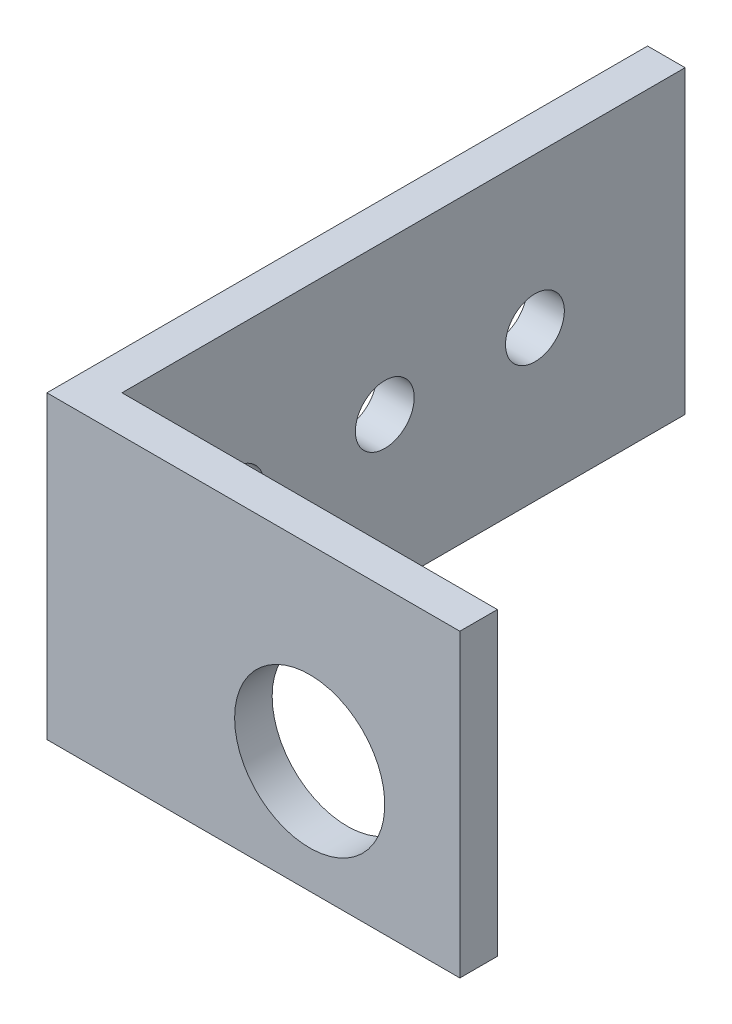
ISO-10303-21;
HEADER;
FILE_DESCRIPTION(('STEP AP214'),'2;1');
FILE_NAME('part.step','',(''),(''),'','','');
FILE_SCHEMA(('AUTOMOTIVE_DESIGN { 1 0 10303 214 1 1 1 1 }'));
ENDSEC;
DATA;
#1=APPLICATION_CONTEXT('core data for automotive mechanical design processes');
#2=APPLICATION_PROTOCOL_DEFINITION('international standard','automotive_design',2000,#1);
#3=PRODUCT_CONTEXT('',#1,'mechanical');
#4=PRODUCT('Part','Part','',(#3));
#5=PRODUCT_RELATED_PRODUCT_CATEGORY('part','',(#4));
#6=PRODUCT_DEFINITION_FORMATION('','',#4);
#7=PRODUCT_DEFINITION_CONTEXT('part definition',#1,'design');
#8=PRODUCT_DEFINITION('design','',#6,#7);
#9=PRODUCT_DEFINITION_SHAPE('','',#8);
#10=(LENGTH_UNIT() NAMED_UNIT(*) SI_UNIT(.MILLI.,.METRE.));
#11=(NAMED_UNIT(*) PLANE_ANGLE_UNIT() SI_UNIT($,.RADIAN.));
#12=(NAMED_UNIT(*) SI_UNIT($,.STERADIAN.) SOLID_ANGLE_UNIT());
#13=UNCERTAINTY_MEASURE_WITH_UNIT(LENGTH_MEASURE(1.E-05),#10,'distance_accuracy_value','');
#14=(GEOMETRIC_REPRESENTATION_CONTEXT(3) GLOBAL_UNCERTAINTY_ASSIGNED_CONTEXT((#13)) GLOBAL_UNIT_ASSIGNED_CONTEXT((#10,
#11,#12)) REPRESENTATION_CONTEXT('',''));
#15=CARTESIAN_POINT('',(0.,0.,0.));
#16=DIRECTION('',(0.,0.,1.));
#17=DIRECTION('',(1.,0.,0.));
#18=AXIS2_PLACEMENT_3D('',#15,#16,#17);
#19=CARTESIAN_POINT('',(34.925,25.4,0.));
#20=DIRECTION('',(0.,0.,-1.));
#21=DIRECTION('',(-1.,0.,0.));
#22=AXIS2_PLACEMENT_3D('',#19,#20,#21);
#23=PLANE('',#22);
#24=CARTESIAN_POINT('',(22.225,9.525,0.));
#25=DIRECTION('',(0.,0.,-1.));
#26=DIRECTION('',(-1.,0.,0.));
#27=AXIS2_PLACEMENT_3D('',#24,#25,#26);
#28=CIRCLE('',#27,6.35);
#29=CARTESIAN_POINT('',(15.875,9.525,0.));
#30=VERTEX_POINT('',#29);
#31=EDGE_CURVE('E135',#30,#30,#28,.T.);
#32=ORIENTED_EDGE('',*,*,#31,.T.);
#33=EDGE_LOOP('',(#32));
#34=FACE_BOUND('',#33,.T.);
#35=DIRECTION('',(1.,0.,0.));
#36=VECTOR('',#35,1.);
#37=CARTESIAN_POINT('',(34.925,0.,0.));
#38=LINE('',#37,#36);
#39=CARTESIAN_POINT('',(0.,0.,0.));
#40=VERTEX_POINT('',#39);
#41=CARTESIAN_POINT('',(34.925,0.,0.));
#42=VERTEX_POINT('',#41);
#43=EDGE_CURVE('E130',#40,#42,#38,.T.);
#44=ORIENTED_EDGE('',*,*,#43,.T.);
#45=DIRECTION('',(0.,-1.,0.));
#46=VECTOR('',#45,1.);
#47=CARTESIAN_POINT('',(34.925,25.4,0.));
#48=LINE('',#47,#46);
#49=CARTESIAN_POINT('',(34.925,25.4,0.));
#50=VERTEX_POINT('',#49);
#51=EDGE_CURVE('E11',#50,#42,#48,.T.);
#52=ORIENTED_EDGE('',*,*,#51,.F.);
#53=DIRECTION('',(1.,0.,0.));
#54=VECTOR('',#53,1.);
#55=CARTESIAN_POINT('',(34.925,25.4,0.));
#56=LINE('',#55,#54);
#57=CARTESIAN_POINT('',(0.,25.4,0.));
#58=VERTEX_POINT('',#57);
#59=EDGE_CURVE('E147',#58,#50,#56,.T.);
#60=ORIENTED_EDGE('',*,*,#59,.F.);
#61=DIRECTION('',(0.,-1.,0.));
#62=VECTOR('',#61,1.);
#63=CARTESIAN_POINT('',(0.,25.4,0.));
#64=LINE('',#63,#62);
#65=EDGE_CURVE('E126',#58,#40,#64,.T.);
#66=ORIENTED_EDGE('',*,*,#65,.T.);
#67=EDGE_LOOP('',(#44,#52,#60,#66));
#68=FACE_BOUND('',#67,.T.);
#69=ADVANCED_FACE('F40',(#34,#68),#23,.F.);
#70=CARTESIAN_POINT('',(34.925,25.4,-3.175));
#71=DIRECTION('',(-1.,0.,0.));
#72=DIRECTION('',(0.,0.,1.));
#73=AXIS2_PLACEMENT_3D('',#70,#71,#72);
#74=PLANE('',#73);
#75=DIRECTION('',(0.,0.,-1.));
#76=VECTOR('',#75,1.);
#77=CARTESIAN_POINT('',(34.925,0.,-3.175));
#78=LINE('',#77,#76);
#79=CARTESIAN_POINT('',(34.925,0.,-3.175));
#80=VERTEX_POINT('',#79);
#81=EDGE_CURVE('E134',#42,#80,#78,.T.);
#82=ORIENTED_EDGE('',*,*,#81,.T.);
#83=DIRECTION('',(0.,-1.,0.));
#84=VECTOR('',#83,1.);
#85=CARTESIAN_POINT('',(34.925,25.4,-3.175));
#86=LINE('',#85,#84);
#87=CARTESIAN_POINT('',(34.925,25.4,-3.175));
#88=VERTEX_POINT('',#87);
#89=EDGE_CURVE('E49',#88,#80,#86,.T.);
#90=ORIENTED_EDGE('',*,*,#89,.F.);
#91=DIRECTION('',(0.,0.,-1.));
#92=VECTOR('',#91,1.);
#93=CARTESIAN_POINT('',(34.925,25.4,-3.175));
#94=LINE('',#93,#92);
#95=EDGE_CURVE('E94',#50,#88,#94,.T.);
#96=ORIENTED_EDGE('',*,*,#95,.F.);
#97=ORIENTED_EDGE('',*,*,#51,.T.);
#98=EDGE_LOOP('',(#82,#90,#96,#97));
#99=FACE_BOUND('',#98,.T.);
#100=ADVANCED_FACE('F179',(#99),#74,.F.);
#101=CARTESIAN_POINT('',(3.175,25.4,-3.175));
#102=DIRECTION('',(0.,0.,1.));
#103=DIRECTION('',(1.,0.,0.));
#104=AXIS2_PLACEMENT_3D('',#101,#102,#103);
#105=PLANE('',#104);
#106=CARTESIAN_POINT('',(22.225,9.525,-3.175));
#107=DIRECTION('',(0.,0.,-1.));
#108=DIRECTION('',(-1.,0.,0.));
#109=AXIS2_PLACEMENT_3D('',#106,#107,#108);
#110=CIRCLE('',#109,6.35);
#111=CARTESIAN_POINT('',(15.875,9.525,-3.175));
#112=VERTEX_POINT('',#111);
#113=EDGE_CURVE('E188',#112,#112,#110,.T.);
#114=ORIENTED_EDGE('',*,*,#113,.F.);
#115=EDGE_LOOP('',(#114));
#116=FACE_BOUND('',#115,.T.);
#117=DIRECTION('',(-1.,0.,0.));
#118=VECTOR('',#117,1.);
#119=CARTESIAN_POINT('',(3.175,0.,-3.175));
#120=LINE('',#119,#118);
#121=CARTESIAN_POINT('',(3.175,0.,-3.175));
#122=VERTEX_POINT('',#121);
#123=EDGE_CURVE('E138',#80,#122,#120,.T.);
#124=ORIENTED_EDGE('',*,*,#123,.T.);
#125=DIRECTION('',(0.,-1.,0.));
#126=VECTOR('',#125,1.);
#127=CARTESIAN_POINT('',(3.175,25.4,-3.175));
#128=LINE('',#127,#126);
#129=CARTESIAN_POINT('',(3.175,25.4,-3.175));
#130=VERTEX_POINT('',#129);
#131=EDGE_CURVE('E118',#130,#122,#128,.T.);
#132=ORIENTED_EDGE('',*,*,#131,.F.);
#133=DIRECTION('',(-1.,0.,0.));
#134=VECTOR('',#133,1.);
#135=CARTESIAN_POINT('',(3.175,25.4,-3.175));
#136=LINE('',#135,#134);
#137=EDGE_CURVE('E107',#88,#130,#136,.T.);
#138=ORIENTED_EDGE('',*,*,#137,.F.);
#139=ORIENTED_EDGE('',*,*,#89,.T.);
#140=EDGE_LOOP('',(#124,#132,#138,#139));
#141=FACE_BOUND('',#140,.T.);
#142=ADVANCED_FACE('F158',(#116,#141),#105,.F.);
#143=CARTESIAN_POINT('',(3.175,25.4,-50.8));
#144=DIRECTION('',(-1.,0.,0.));
#145=DIRECTION('',(0.,0.,1.));
#146=AXIS2_PLACEMENT_3D('',#143,#144,#145);
#147=PLANE('',#146);
#148=CARTESIAN_POINT('',(3.175,12.7,-38.1));
#149=DIRECTION('',(1.,0.,0.));
#150=DIRECTION('',(0.,0.,-1.));
#151=AXIS2_PLACEMENT_3D('',#148,#149,#150);
#152=CIRCLE('',#151,2.4892);
#153=CARTESIAN_POINT('',(3.175,12.7,-40.5892));
#154=VERTEX_POINT('',#153);
#155=EDGE_CURVE('E219',#154,#154,#152,.T.);
#156=ORIENTED_EDGE('',*,*,#155,.F.);
#157=EDGE_LOOP('',(#156));
#158=FACE_BOUND('',#157,.T.);
#159=CARTESIAN_POINT('',(3.175,12.7,-12.7));
#160=DIRECTION('',(1.,0.,0.));
#161=DIRECTION('',(0.,0.,-1.));
#162=AXIS2_PLACEMENT_3D('',#159,#160,#161);
#163=CIRCLE('',#162,2.4892);
#164=CARTESIAN_POINT('',(3.175,12.7,-15.1892));
#165=VERTEX_POINT('',#164);
#166=EDGE_CURVE('E226',#165,#165,#163,.T.);
#167=ORIENTED_EDGE('',*,*,#166,.F.);
#168=EDGE_LOOP('',(#167));
#169=FACE_BOUND('',#168,.T.);
#170=CARTESIAN_POINT('',(3.175,12.7,-25.4));
#171=DIRECTION('',(1.,0.,0.));
#172=DIRECTION('',(0.,0.,-1.));
#173=AXIS2_PLACEMENT_3D('',#170,#171,#172);
#174=CIRCLE('',#173,2.4892);
#175=CARTESIAN_POINT('',(3.175,12.7,-27.8892));
#176=VERTEX_POINT('',#175);
#177=EDGE_CURVE('E196',#176,#176,#174,.T.);
#178=ORIENTED_EDGE('',*,*,#177,.F.);
#179=EDGE_LOOP('',(#178));
#180=FACE_BOUND('',#179,.T.);
#181=DIRECTION('',(0.,0.,-1.));
#182=VECTOR('',#181,1.);
#183=CARTESIAN_POINT('',(3.175,0.,-50.8));
#184=LINE('',#183,#182);
#185=CARTESIAN_POINT('',(3.175,0.,-50.8));
#186=VERTEX_POINT('',#185);
#187=EDGE_CURVE('E116',#122,#186,#184,.T.);
#188=ORIENTED_EDGE('',*,*,#187,.T.);
#189=DIRECTION('',(0.,-1.,0.));
#190=VECTOR('',#189,1.);
#191=CARTESIAN_POINT('',(3.175,25.4,-50.8));
#192=LINE('',#191,#190);
#193=CARTESIAN_POINT('',(3.175,25.4,-50.8));
#194=VERTEX_POINT('',#193);
#195=EDGE_CURVE('E113',#194,#186,#192,.T.);
#196=ORIENTED_EDGE('',*,*,#195,.F.);
#197=DIRECTION('',(0.,0.,-1.));
#198=VECTOR('',#197,1.);
#199=CARTESIAN_POINT('',(3.175,25.4,-50.8));
#200=LINE('',#199,#198);
#201=EDGE_CURVE('E101',#130,#194,#200,.T.);
#202=ORIENTED_EDGE('',*,*,#201,.F.);
#203=ORIENTED_EDGE('',*,*,#131,.T.);
#204=EDGE_LOOP('',(#188,#196,#202,#203));
#205=FACE_BOUND('',#204,.T.);
#206=ADVANCED_FACE('F114',(#158,#169,#180,#205),#147,.F.);
#207=CARTESIAN_POINT('',(0.,25.4,-50.8));
#208=DIRECTION('',(0.,0.,1.));
#209=DIRECTION('',(1.,0.,0.));
#210=AXIS2_PLACEMENT_3D('',#207,#208,#209);
#211=PLANE('',#210);
#212=DIRECTION('',(-1.,0.,0.));
#213=VECTOR('',#212,1.);
#214=CARTESIAN_POINT('',(0.,0.,-50.8));
#215=LINE('',#214,#213);
#216=CARTESIAN_POINT('',(0.,0.,-50.8));
#217=VERTEX_POINT('',#216);
#218=EDGE_CURVE('E80',#186,#217,#215,.T.);
#219=ORIENTED_EDGE('',*,*,#218,.T.);
#220=DIRECTION('',(0.,-1.,0.));
#221=VECTOR('',#220,1.);
#222=CARTESIAN_POINT('',(0.,25.4,-50.8));
#223=LINE('',#222,#221);
#224=CARTESIAN_POINT('',(0.,25.4,-50.8));
#225=VERTEX_POINT('',#224);
#226=EDGE_CURVE('E119',#225,#217,#223,.T.);
#227=ORIENTED_EDGE('',*,*,#226,.F.);
#228=DIRECTION('',(-1.,0.,0.));
#229=VECTOR('',#228,1.);
#230=CARTESIAN_POINT('',(0.,25.4,-50.8));
#231=LINE('',#230,#229);
#232=EDGE_CURVE('E105',#194,#225,#231,.T.);
#233=ORIENTED_EDGE('',*,*,#232,.F.);
#234=ORIENTED_EDGE('',*,*,#195,.T.);
#235=EDGE_LOOP('',(#219,#227,#233,#234));
#236=FACE_BOUND('',#235,.T.);
#237=ADVANCED_FACE('F121',(#236),#211,.F.);
#238=CARTESIAN_POINT('',(0.,25.4,0.));
#239=DIRECTION('',(1.,0.,0.));
#240=DIRECTION('',(0.,0.,-1.));
#241=AXIS2_PLACEMENT_3D('',#238,#239,#240);
#242=PLANE('',#241);
#243=CARTESIAN_POINT('',(0.,12.7,-38.1));
#244=DIRECTION('',(1.,0.,0.));
#245=DIRECTION('',(0.,0.,-1.));
#246=AXIS2_PLACEMENT_3D('',#243,#244,#245);
#247=CIRCLE('',#246,2.4892);
#248=CARTESIAN_POINT('',(0.,12.7,-40.5892));
#249=VERTEX_POINT('',#248);
#250=EDGE_CURVE('E223',#249,#249,#247,.T.);
#251=ORIENTED_EDGE('',*,*,#250,.T.);
#252=EDGE_LOOP('',(#251));
#253=FACE_BOUND('',#252,.T.);
#254=CARTESIAN_POINT('',(0.,12.7,-12.7));
#255=DIRECTION('',(1.,0.,0.));
#256=DIRECTION('',(0.,0.,-1.));
#257=AXIS2_PLACEMENT_3D('',#254,#255,#256);
#258=CIRCLE('',#257,2.4892);
#259=CARTESIAN_POINT('',(0.,12.7,-15.1892));
#260=VERTEX_POINT('',#259);
#261=EDGE_CURVE('E215',#260,#260,#258,.T.);
#262=ORIENTED_EDGE('',*,*,#261,.T.);
#263=EDGE_LOOP('',(#262));
#264=FACE_BOUND('',#263,.T.);
#265=CARTESIAN_POINT('',(0.,12.7,-25.4));
#266=DIRECTION('',(1.,0.,0.));
#267=DIRECTION('',(0.,0.,-1.));
#268=AXIS2_PLACEMENT_3D('',#265,#266,#267);
#269=CIRCLE('',#268,2.4892);
#270=CARTESIAN_POINT('',(0.,12.7,-27.8892));
#271=VERTEX_POINT('',#270);
#272=EDGE_CURVE('E193',#271,#271,#269,.T.);
#273=ORIENTED_EDGE('',*,*,#272,.T.);
#274=EDGE_LOOP('',(#273));
#275=FACE_BOUND('',#274,.T.);
#276=DIRECTION('',(0.,0.,1.));
#277=VECTOR('',#276,1.);
#278=CARTESIAN_POINT('',(0.,0.,0.));
#279=LINE('',#278,#277);
#280=EDGE_CURVE('E86',#217,#40,#279,.T.);
#281=ORIENTED_EDGE('',*,*,#280,.T.);
#282=ORIENTED_EDGE('',*,*,#65,.F.);
#283=DIRECTION('',(0.,0.,1.));
#284=VECTOR('',#283,1.);
#285=CARTESIAN_POINT('',(0.,25.4,0.));
#286=LINE('',#285,#284);
#287=EDGE_CURVE('E57',#225,#58,#286,.T.);
#288=ORIENTED_EDGE('',*,*,#287,.F.);
#289=ORIENTED_EDGE('',*,*,#226,.T.);
#290=EDGE_LOOP('',(#281,#282,#288,#289));
#291=FACE_BOUND('',#290,.T.);
#292=ADVANCED_FACE('F165',(#253,#264,#275,#291),#242,.F.);
#293=CARTESIAN_POINT('',(0.,25.4,0.));
#294=DIRECTION('',(0.,-1.,0.));
#295=DIRECTION('',(0.,0.,-1.));
#296=AXIS2_PLACEMENT_3D('',#293,#294,#295);
#297=PLANE('',#296);
#298=ORIENTED_EDGE('',*,*,#59,.T.);
#299=ORIENTED_EDGE('',*,*,#95,.T.);
#300=ORIENTED_EDGE('',*,*,#137,.T.);
#301=ORIENTED_EDGE('',*,*,#201,.T.);
#302=ORIENTED_EDGE('',*,*,#232,.T.);
#303=ORIENTED_EDGE('',*,*,#287,.T.);
#304=EDGE_LOOP('',(#298,#299,#300,#301,#302,#303));
#305=FACE_BOUND('',#304,.T.);
#306=ADVANCED_FACE('F103',(#305),#297,.F.);
#307=CARTESIAN_POINT('',(0.,0.,0.));
#308=DIRECTION('',(0.,-1.,0.));
#309=DIRECTION('',(0.,0.,-1.));
#310=AXIS2_PLACEMENT_3D('',#307,#308,#309);
#311=PLANE('',#310);
#312=ORIENTED_EDGE('',*,*,#43,.F.);
#313=ORIENTED_EDGE('',*,*,#280,.F.);
#314=ORIENTED_EDGE('',*,*,#218,.F.);
#315=ORIENTED_EDGE('',*,*,#187,.F.);
#316=ORIENTED_EDGE('',*,*,#123,.F.);
#317=ORIENTED_EDGE('',*,*,#81,.F.);
#318=EDGE_LOOP('',(#312,#313,#314,#315,#316,#317));
#319=FACE_BOUND('',#318,.T.);
#320=ADVANCED_FACE('F161',(#319),#311,.T.);
#321=CARTESIAN_POINT('',(22.225,9.525,0.));
#322=DIRECTION('',(0.,0.,-1.));
#323=DIRECTION('',(-1.,0.,0.));
#324=AXIS2_PLACEMENT_3D('',#321,#322,#323);
#325=CYLINDRICAL_SURFACE('',#324,6.35);
#326=ORIENTED_EDGE('',*,*,#31,.F.);
#327=EDGE_LOOP('',(#326));
#328=FACE_BOUND('',#327,.T.);
#329=ORIENTED_EDGE('',*,*,#113,.T.);
#330=EDGE_LOOP('',(#329));
#331=FACE_BOUND('',#330,.T.);
#332=ADVANCED_FACE('F251',(#328,#331),#325,.F.);
#333=CARTESIAN_POINT('',(0.,12.7,-25.4));
#334=DIRECTION('',(1.,0.,0.));
#335=DIRECTION('',(0.,0.,-1.));
#336=AXIS2_PLACEMENT_3D('',#333,#334,#335);
#337=CYLINDRICAL_SURFACE('',#336,2.4892);
#338=ORIENTED_EDGE('',*,*,#272,.F.);
#339=EDGE_LOOP('',(#338));
#340=FACE_BOUND('',#339,.T.);
#341=ORIENTED_EDGE('',*,*,#177,.T.);
#342=EDGE_LOOP('',(#341));
#343=FACE_BOUND('',#342,.T.);
#344=ADVANCED_FACE('F240',(#340,#343),#337,.F.);
#345=CARTESIAN_POINT('',(0.,12.7,-12.7));
#346=DIRECTION('',(1.,0.,0.));
#347=DIRECTION('',(0.,0.,-1.));
#348=AXIS2_PLACEMENT_3D('',#345,#346,#347);
#349=CYLINDRICAL_SURFACE('',#348,2.4892);
#350=ORIENTED_EDGE('',*,*,#261,.F.);
#351=EDGE_LOOP('',(#350));
#352=FACE_BOUND('',#351,.T.);
#353=ORIENTED_EDGE('',*,*,#166,.T.);
#354=EDGE_LOOP('',(#353));
#355=FACE_BOUND('',#354,.T.);
#356=ADVANCED_FACE('F236',(#352,#355),#349,.F.);
#357=CARTESIAN_POINT('',(0.,12.7,-38.1));
#358=DIRECTION('',(1.,0.,0.));
#359=DIRECTION('',(0.,0.,-1.));
#360=AXIS2_PLACEMENT_3D('',#357,#358,#359);
#361=CYLINDRICAL_SURFACE('',#360,2.4892);
#362=ORIENTED_EDGE('',*,*,#250,.F.);
#363=EDGE_LOOP('',(#362));
#364=FACE_BOUND('',#363,.T.);
#365=ORIENTED_EDGE('',*,*,#155,.T.);
#366=EDGE_LOOP('',(#365));
#367=FACE_BOUND('',#366,.T.);
#368=ADVANCED_FACE('F239',(#364,#367),#361,.F.);
#369=CLOSED_SHELL('',(#69,#100,#142,#206,#237,#292,#306,#320,#332,#344,#356,#368));
#370=MANIFOLD_SOLID_BREP('B2',#369);
#371=ADVANCED_BREP_SHAPE_REPRESENTATION('',(#18,#370),#14);
#372=SHAPE_DEFINITION_REPRESENTATION(#9,#371);
ENDSEC;
END-ISO-10303-21;
